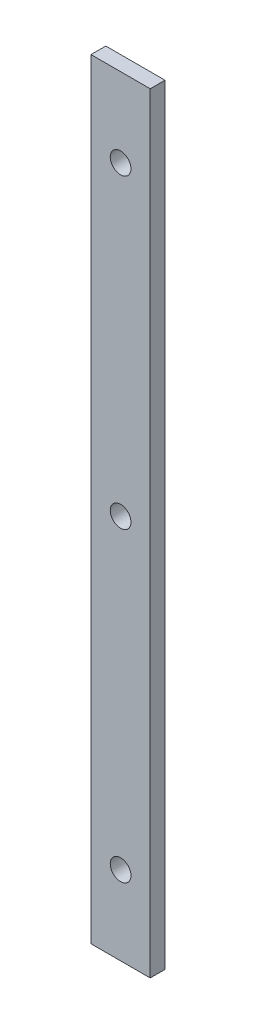
ISO-10303-21;
HEADER;
FILE_DESCRIPTION(('STEP AP214'),'2;1');
FILE_NAME('part.step','',(''),(''),'','','');
FILE_SCHEMA(('AUTOMOTIVE_DESIGN { 1 0 10303 214 1 1 1 1 }'));
ENDSEC;
DATA;
#1=APPLICATION_CONTEXT('core data for automotive mechanical design processes');
#2=APPLICATION_PROTOCOL_DEFINITION('international standard','automotive_design',2000,#1);
#3=PRODUCT_CONTEXT('',#1,'mechanical');
#4=PRODUCT('Part','Part','',(#3));
#5=PRODUCT_RELATED_PRODUCT_CATEGORY('part','',(#4));
#6=PRODUCT_DEFINITION_FORMATION('','',#4);
#7=PRODUCT_DEFINITION_CONTEXT('part definition',#1,'design');
#8=PRODUCT_DEFINITION('design','',#6,#7);
#9=PRODUCT_DEFINITION_SHAPE('','',#8);
#10=(LENGTH_UNIT() NAMED_UNIT(*) SI_UNIT(.MILLI.,.METRE.));
#11=(NAMED_UNIT(*) PLANE_ANGLE_UNIT() SI_UNIT($,.RADIAN.));
#12=(NAMED_UNIT(*) SI_UNIT($,.STERADIAN.) SOLID_ANGLE_UNIT());
#13=UNCERTAINTY_MEASURE_WITH_UNIT(LENGTH_MEASURE(1.E-05),#10,'distance_accuracy_value','');
#14=(GEOMETRIC_REPRESENTATION_CONTEXT(3) GLOBAL_UNCERTAINTY_ASSIGNED_CONTEXT((#13)) GLOBAL_UNIT_ASSIGNED_CONTEXT((#10,
#11,#12)) REPRESENTATION_CONTEXT('',''));
#15=CARTESIAN_POINT('',(0.,0.,0.));
#16=DIRECTION('',(0.,0.,1.));
#17=DIRECTION('',(1.,0.,0.));
#18=AXIS2_PLACEMENT_3D('',#15,#16,#17);
#19=CARTESIAN_POINT('',(82.55,78.,3.));
#20=DIRECTION('',(-1.,0.,0.));
#21=DIRECTION('',(0.,-1.,0.));
#22=AXIS2_PLACEMENT_3D('',#19,#20,#21);
#23=PLANE('',#22);
#24=DIRECTION('',(0.,1.,0.));
#25=VECTOR('',#24,1.);
#26=CARTESIAN_POINT('',(82.55,78.,0.));
#27=LINE('',#26,#25);
#28=CARTESIAN_POINT('',(82.55,-78.,0.));
#29=VERTEX_POINT('',#28);
#30=CARTESIAN_POINT('',(82.55,78.,0.));
#31=VERTEX_POINT('',#30);
#32=EDGE_CURVE('E109',#29,#31,#27,.T.);
#33=ORIENTED_EDGE('',*,*,#32,.T.);
#34=DIRECTION('',(0.,0.,-1.));
#35=VECTOR('',#34,1.);
#36=CARTESIAN_POINT('',(82.55,78.,3.));
#37=LINE('',#36,#35);
#38=CARTESIAN_POINT('',(82.55,78.,3.));
#39=VERTEX_POINT('',#38);
#40=EDGE_CURVE('E11',#39,#31,#37,.T.);
#41=ORIENTED_EDGE('',*,*,#40,.F.);
#42=DIRECTION('',(0.,1.,0.));
#43=VECTOR('',#42,1.);
#44=CARTESIAN_POINT('',(82.55,78.,3.));
#45=LINE('',#44,#43);
#46=CARTESIAN_POINT('',(82.55,-78.,3.));
#47=VERTEX_POINT('',#46);
#48=EDGE_CURVE('E92',#47,#39,#45,.T.);
#49=ORIENTED_EDGE('',*,*,#48,.F.);
#50=DIRECTION('',(0.,0.,-1.));
#51=VECTOR('',#50,1.);
#52=CARTESIAN_POINT('',(82.55,-78.,3.));
#53=LINE('',#52,#51);
#54=EDGE_CURVE('E105',#47,#29,#53,.T.);
#55=ORIENTED_EDGE('',*,*,#54,.T.);
#56=EDGE_LOOP('',(#33,#41,#49,#55));
#57=FACE_BOUND('',#56,.T.);
#58=ADVANCED_FACE('F38',(#57),#23,.F.);
#59=CARTESIAN_POINT('',(82.55,78.,3.));
#60=DIRECTION('',(0.,-1.,0.));
#61=DIRECTION('',(0.,0.,-1.));
#62=AXIS2_PLACEMENT_3D('',#59,#60,#61);
#63=PLANE('',#62);
#64=DIRECTION('',(-1.,0.,0.));
#65=VECTOR('',#64,1.);
#66=CARTESIAN_POINT('',(82.55,78.,0.));
#67=LINE('',#66,#65);
#68=CARTESIAN_POINT('',(70.55,78.,0.));
#69=VERTEX_POINT('',#68);
#70=EDGE_CURVE('E97',#31,#69,#67,.T.);
#71=ORIENTED_EDGE('',*,*,#70,.T.);
#72=DIRECTION('',(0.,0.,-1.));
#73=VECTOR('',#72,1.);
#74=CARTESIAN_POINT('',(70.55,78.,3.));
#75=LINE('',#74,#73);
#76=CARTESIAN_POINT('',(70.55,78.,3.));
#77=VERTEX_POINT('',#76);
#78=EDGE_CURVE('E46',#77,#69,#75,.T.);
#79=ORIENTED_EDGE('',*,*,#78,.F.);
#80=DIRECTION('',(-1.,0.,0.));
#81=VECTOR('',#80,1.);
#82=CARTESIAN_POINT('',(82.55,78.,3.));
#83=LINE('',#82,#81);
#84=EDGE_CURVE('E87',#39,#77,#83,.T.);
#85=ORIENTED_EDGE('',*,*,#84,.F.);
#86=ORIENTED_EDGE('',*,*,#40,.T.);
#87=EDGE_LOOP('',(#71,#79,#85,#86));
#88=FACE_BOUND('',#87,.T.);
#89=ADVANCED_FACE('F96',(#88),#63,.F.);
#90=CARTESIAN_POINT('',(70.55,78.,3.));
#91=DIRECTION('',(1.,0.,0.));
#92=DIRECTION('',(0.,1.,0.));
#93=AXIS2_PLACEMENT_3D('',#90,#91,#92);
#94=PLANE('',#93);
#95=DIRECTION('',(0.,-1.,0.));
#96=VECTOR('',#95,1.);
#97=CARTESIAN_POINT('',(70.55,78.,0.));
#98=LINE('',#97,#96);
#99=CARTESIAN_POINT('',(70.55,-78.,0.));
#100=VERTEX_POINT('',#99);
#101=EDGE_CURVE('E72',#69,#100,#98,.T.);
#102=ORIENTED_EDGE('',*,*,#101,.T.);
#103=DIRECTION('',(0.,0.,-1.));
#104=VECTOR('',#103,1.);
#105=CARTESIAN_POINT('',(70.55,-78.,3.));
#106=LINE('',#105,#104);
#107=CARTESIAN_POINT('',(70.55,-78.,3.));
#108=VERTEX_POINT('',#107);
#109=EDGE_CURVE('E99',#108,#100,#106,.T.);
#110=ORIENTED_EDGE('',*,*,#109,.F.);
#111=DIRECTION('',(0.,-1.,0.));
#112=VECTOR('',#111,1.);
#113=CARTESIAN_POINT('',(70.55,78.,3.));
#114=LINE('',#113,#112);
#115=EDGE_CURVE('E90',#77,#108,#114,.T.);
#116=ORIENTED_EDGE('',*,*,#115,.F.);
#117=ORIENTED_EDGE('',*,*,#78,.T.);
#118=EDGE_LOOP('',(#102,#110,#116,#117));
#119=FACE_BOUND('',#118,.T.);
#120=ADVANCED_FACE('F100',(#119),#94,.F.);
#121=CARTESIAN_POINT('',(82.55,-78.,3.));
#122=DIRECTION('',(0.,1.,0.));
#123=DIRECTION('',(0.,0.,1.));
#124=AXIS2_PLACEMENT_3D('',#121,#122,#123);
#125=PLANE('',#124);
#126=DIRECTION('',(1.,0.,0.));
#127=VECTOR('',#126,1.);
#128=CARTESIAN_POINT('',(82.55,-78.,0.));
#129=LINE('',#128,#127);
#130=EDGE_CURVE('E80',#100,#29,#129,.T.);
#131=ORIENTED_EDGE('',*,*,#130,.T.);
#132=ORIENTED_EDGE('',*,*,#54,.F.);
#133=DIRECTION('',(1.,0.,0.));
#134=VECTOR('',#133,1.);
#135=CARTESIAN_POINT('',(82.55,-78.,3.));
#136=LINE('',#135,#134);
#137=EDGE_CURVE('E54',#108,#47,#136,.T.);
#138=ORIENTED_EDGE('',*,*,#137,.F.);
#139=ORIENTED_EDGE('',*,*,#109,.T.);
#140=EDGE_LOOP('',(#131,#132,#138,#139));
#141=FACE_BOUND('',#140,.T.);
#142=ADVANCED_FACE('F120',(#141),#125,.F.);
#143=CARTESIAN_POINT('',(0.,0.,3.));
#144=DIRECTION('',(0.,0.,-1.));
#145=DIRECTION('',(-1.,0.,0.));
#146=AXIS2_PLACEMENT_3D('',#143,#144,#145);
#147=PLANE('',#146);
#148=CARTESIAN_POINT('',(76.55,62.,3.));
#149=DIRECTION('',(0.,0.,-1.));
#150=DIRECTION('',(-1.,0.,0.));
#151=AXIS2_PLACEMENT_3D('',#148,#149,#150);
#152=CIRCLE('',#151,2.1);
#153=CARTESIAN_POINT('',(74.45,62.,3.));
#154=VERTEX_POINT('',#153);
#155=EDGE_CURVE('E142',#154,#154,#152,.F.);
#156=ORIENTED_EDGE('',*,*,#155,.F.);
#157=EDGE_LOOP('',(#156));
#158=FACE_BOUND('',#157,.T.);
#159=CARTESIAN_POINT('',(76.55,0.,3.));
#160=DIRECTION('',(0.,0.,-1.));
#161=DIRECTION('',(-1.,0.,0.));
#162=AXIS2_PLACEMENT_3D('',#159,#160,#161);
#163=CIRCLE('',#162,2.1);
#164=CARTESIAN_POINT('',(74.45,0.,3.));
#165=VERTEX_POINT('',#164);
#166=EDGE_CURVE('E134',#165,#165,#163,.F.);
#167=ORIENTED_EDGE('',*,*,#166,.F.);
#168=EDGE_LOOP('',(#167));
#169=FACE_BOUND('',#168,.T.);
#170=CARTESIAN_POINT('',(76.55,-62.,3.));
#171=DIRECTION('',(0.,0.,-1.));
#172=DIRECTION('',(-1.,0.,0.));
#173=AXIS2_PLACEMENT_3D('',#170,#171,#172);
#174=CIRCLE('',#173,2.1);
#175=CARTESIAN_POINT('',(74.45,-62.,3.));
#176=VERTEX_POINT('',#175);
#177=EDGE_CURVE('E112',#176,#176,#174,.F.);
#178=ORIENTED_EDGE('',*,*,#177,.F.);
#179=EDGE_LOOP('',(#178));
#180=FACE_BOUND('',#179,.T.);
#181=ORIENTED_EDGE('',*,*,#48,.T.);
#182=ORIENTED_EDGE('',*,*,#84,.T.);
#183=ORIENTED_EDGE('',*,*,#115,.T.);
#184=ORIENTED_EDGE('',*,*,#137,.T.);
#185=EDGE_LOOP('',(#181,#182,#183,#184));
#186=FACE_BOUND('',#185,.T.);
#187=ADVANCED_FACE('F88',(#158,#169,#180,#186),#147,.F.);
#188=CARTESIAN_POINT('',(0.,0.,0.));
#189=DIRECTION('',(0.,0.,-1.));
#190=DIRECTION('',(-1.,0.,0.));
#191=AXIS2_PLACEMENT_3D('',#188,#189,#190);
#192=PLANE('',#191);
#193=CARTESIAN_POINT('',(76.55,62.,0.));
#194=DIRECTION('',(0.,0.,-1.));
#195=DIRECTION('',(-1.,0.,0.));
#196=AXIS2_PLACEMENT_3D('',#193,#194,#195);
#197=CIRCLE('',#196,2.1);
#198=CARTESIAN_POINT('',(74.45,62.,0.));
#199=VERTEX_POINT('',#198);
#200=EDGE_CURVE('E145',#199,#199,#197,.T.);
#201=ORIENTED_EDGE('',*,*,#200,.F.);
#202=EDGE_LOOP('',(#201));
#203=FACE_BOUND('',#202,.T.);
#204=CARTESIAN_POINT('',(76.55,0.,0.));
#205=DIRECTION('',(0.,0.,-1.));
#206=DIRECTION('',(-1.,0.,0.));
#207=AXIS2_PLACEMENT_3D('',#204,#205,#206);
#208=CIRCLE('',#207,2.1);
#209=CARTESIAN_POINT('',(74.45,0.,0.));
#210=VERTEX_POINT('',#209);
#211=EDGE_CURVE('E138',#210,#210,#208,.T.);
#212=ORIENTED_EDGE('',*,*,#211,.F.);
#213=EDGE_LOOP('',(#212));
#214=FACE_BOUND('',#213,.T.);
#215=CARTESIAN_POINT('',(76.55,-62.,0.));
#216=DIRECTION('',(0.,0.,-1.));
#217=DIRECTION('',(-1.,0.,0.));
#218=AXIS2_PLACEMENT_3D('',#215,#216,#217);
#219=CIRCLE('',#218,2.1);
#220=CARTESIAN_POINT('',(74.45,-62.,0.));
#221=VERTEX_POINT('',#220);
#222=EDGE_CURVE('E130',#221,#221,#219,.T.);
#223=ORIENTED_EDGE('',*,*,#222,.F.);
#224=EDGE_LOOP('',(#223));
#225=FACE_BOUND('',#224,.T.);
#226=ORIENTED_EDGE('',*,*,#32,.F.);
#227=ORIENTED_EDGE('',*,*,#130,.F.);
#228=ORIENTED_EDGE('',*,*,#101,.F.);
#229=ORIENTED_EDGE('',*,*,#70,.F.);
#230=EDGE_LOOP('',(#226,#227,#228,#229));
#231=FACE_BOUND('',#230,.T.);
#232=ADVANCED_FACE('F123',(#203,#214,#225,#231),#192,.T.);
#233=CARTESIAN_POINT('',(76.55,-62.,3.001));
#234=DIRECTION('',(0.,0.,-1.));
#235=DIRECTION('',(-1.,0.,0.));
#236=AXIS2_PLACEMENT_3D('',#233,#234,#235);
#237=CYLINDRICAL_SURFACE('',#236,2.1);
#238=CARTESIAN_POINT('',(74.45,-62.,0.));
#239=CARTESIAN_POINT('',(74.45,-62.,0.0312500000000005));
#240=CARTESIAN_POINT('',(74.45,-62.,0.0625000000000005));
#241=CARTESIAN_POINT('',(74.45,-62.,0.125000000000001));
#242=CARTESIAN_POINT('',(74.45,-62.,0.156250000000001));
#243=CARTESIAN_POINT('',(74.45,-62.,0.218750000000001));
#244=CARTESIAN_POINT('',(74.45,-62.,0.250000000000001));
#245=CARTESIAN_POINT('',(74.45,-62.,0.312500000000001));
#246=CARTESIAN_POINT('',(74.45,-62.,0.34375));
#247=CARTESIAN_POINT('',(74.45,-62.,0.40625));
#248=CARTESIAN_POINT('',(74.45,-62.,0.4375));
#249=CARTESIAN_POINT('',(74.45,-62.,0.5));
#250=CARTESIAN_POINT('',(74.45,-62.,0.53125));
#251=CARTESIAN_POINT('',(74.45,-62.,0.593750000000001));
#252=CARTESIAN_POINT('',(74.45,-62.,0.625000000000001));
#253=CARTESIAN_POINT('',(74.45,-62.,0.687500000000001));
#254=CARTESIAN_POINT('',(74.45,-62.,0.71875));
#255=CARTESIAN_POINT('',(74.45,-62.,0.78125));
#256=CARTESIAN_POINT('',(74.45,-62.,0.8125));
#257=CARTESIAN_POINT('',(74.45,-62.,0.875));
#258=CARTESIAN_POINT('',(74.45,-62.,0.90625));
#259=CARTESIAN_POINT('',(74.45,-62.,0.96875));
#260=CARTESIAN_POINT('',(74.45,-62.,1.));
#261=CARTESIAN_POINT('',(74.45,-62.,1.0625));
#262=CARTESIAN_POINT('',(74.45,-62.,1.09375));
#263=CARTESIAN_POINT('',(74.45,-62.,1.15625));
#264=CARTESIAN_POINT('',(74.45,-62.,1.1875));
#265=CARTESIAN_POINT('',(74.45,-62.,1.25));
#266=CARTESIAN_POINT('',(74.45,-62.,1.28125));
#267=CARTESIAN_POINT('',(74.45,-62.,1.34375));
#268=CARTESIAN_POINT('',(74.45,-62.,1.375));
#269=CARTESIAN_POINT('',(74.45,-62.,1.4375));
#270=CARTESIAN_POINT('',(74.45,-62.,1.46875));
#271=CARTESIAN_POINT('',(74.45,-62.,1.53125));
#272=CARTESIAN_POINT('',(74.45,-62.,1.5625));
#273=CARTESIAN_POINT('',(74.45,-62.,1.625));
#274=CARTESIAN_POINT('',(74.45,-62.,1.65625));
#275=CARTESIAN_POINT('',(74.45,-62.,1.71875));
#276=CARTESIAN_POINT('',(74.45,-62.,1.75));
#277=CARTESIAN_POINT('',(74.45,-62.,1.8125));
#278=CARTESIAN_POINT('',(74.45,-62.,1.84375));
#279=CARTESIAN_POINT('',(74.45,-62.,1.90625));
#280=CARTESIAN_POINT('',(74.45,-62.,1.9375));
#281=CARTESIAN_POINT('',(74.45,-62.,2.));
#282=CARTESIAN_POINT('',(74.45,-62.,2.03125));
#283=CARTESIAN_POINT('',(74.45,-62.,2.09375));
#284=CARTESIAN_POINT('',(74.45,-62.,2.125));
#285=CARTESIAN_POINT('',(74.45,-62.,2.1875));
#286=CARTESIAN_POINT('',(74.45,-62.,2.21875));
#287=CARTESIAN_POINT('',(74.45,-62.,2.28125));
#288=CARTESIAN_POINT('',(74.45,-62.,2.3125));
#289=CARTESIAN_POINT('',(74.45,-62.,2.375));
#290=CARTESIAN_POINT('',(74.45,-62.,2.40625));
#291=CARTESIAN_POINT('',(74.45,-62.,2.46875));
#292=CARTESIAN_POINT('',(74.45,-62.,2.5));
#293=CARTESIAN_POINT('',(74.45,-62.,2.5625));
#294=CARTESIAN_POINT('',(74.45,-62.,2.59375));
#295=CARTESIAN_POINT('',(74.45,-62.,2.65625));
#296=CARTESIAN_POINT('',(74.45,-62.,2.6875));
#297=CARTESIAN_POINT('',(74.45,-62.,2.75));
#298=CARTESIAN_POINT('',(74.45,-62.,2.78125));
#299=CARTESIAN_POINT('',(74.45,-62.,2.84375));
#300=CARTESIAN_POINT('',(74.45,-62.,2.875));
#301=CARTESIAN_POINT('',(74.45,-62.,2.9375));
#302=CARTESIAN_POINT('',(74.45,-62.,2.96875));
#303=CARTESIAN_POINT('',(74.45,-62.,3.));
#304=B_SPLINE_CURVE_WITH_KNOTS('',3,(#238,#239,#240,#241,#242,#243,#244,#245,#246,#247,#248,
#249,#250,#251,#252,#253,#254,#255,#256,#257,#258,#259,#260,#261,#262,#263,#264,#265,#266,#267,
#268,#269,#270,#271,#272,#273,#274,#275,#276,#277,#278,#279,#280,#281,#282,#283,#284,#285,#286,
#287,#288,#289,#290,#291,#292,#293,#294,#295,#296,#297,#298,#299,#300,#301,#302,#303),
.UNSPECIFIED.,.F.,.F.,(4,2,2,2,2,2,2,2,2,2,2,2,2,2,2,2,2,2,2,2,2,2,2,2,2,2,2,2,2,2,2,2,4),(0.,
0.0937500000000001,0.1875,0.28125,0.375,0.46875,0.5625,0.65625,0.75,0.84375,0.9375,1.03125,
1.125,1.21875,1.3125,1.40625,1.5,1.59375,1.6875,1.78125,1.875,1.96875,2.0625,2.15625,2.25,
2.34375,2.4375,2.53125,2.625,2.71875,2.8125,2.90625,3.),.UNSPECIFIED.);
#305=EDGE_CURVE('BSEAM154',#221,#176,#304,.T.);
#306=ORIENTED_EDGE('',*,*,#222,.T.);
#307=ORIENTED_EDGE('',*,*,#177,.T.);
#308=ORIENTED_EDGE('',*,*,#305,.T.);
#309=ORIENTED_EDGE('',*,*,#305,.F.);
#310=EDGE_LOOP('',(#306,#308,#307,#309));
#311=FACE_BOUND('',#310,.T.);
#312=ADVANCED_FACE('F154',(#311),#237,.F.);
#313=CARTESIAN_POINT('',(76.55,0.,3.001));
#314=DIRECTION('',(0.,0.,-1.));
#315=DIRECTION('',(-1.,0.,0.));
#316=AXIS2_PLACEMENT_3D('',#313,#314,#315);
#317=CYLINDRICAL_SURFACE('',#316,2.1);
#318=CARTESIAN_POINT('',(74.45,0.,0.));
#319=CARTESIAN_POINT('',(74.45,0.,0.0312500000000005));
#320=CARTESIAN_POINT('',(74.45,0.,0.0625000000000005));
#321=CARTESIAN_POINT('',(74.45,0.,0.125000000000001));
#322=CARTESIAN_POINT('',(74.45,0.,0.156250000000001));
#323=CARTESIAN_POINT('',(74.45,0.,0.218750000000001));
#324=CARTESIAN_POINT('',(74.45,0.,0.250000000000001));
#325=CARTESIAN_POINT('',(74.45,0.,0.312500000000001));
#326=CARTESIAN_POINT('',(74.45,0.,0.34375));
#327=CARTESIAN_POINT('',(74.45,0.,0.40625));
#328=CARTESIAN_POINT('',(74.45,0.,0.4375));
#329=CARTESIAN_POINT('',(74.45,0.,0.5));
#330=CARTESIAN_POINT('',(74.45,0.,0.53125));
#331=CARTESIAN_POINT('',(74.45,0.,0.593750000000001));
#332=CARTESIAN_POINT('',(74.45,0.,0.625000000000001));
#333=CARTESIAN_POINT('',(74.45,0.,0.687500000000001));
#334=CARTESIAN_POINT('',(74.45,0.,0.71875));
#335=CARTESIAN_POINT('',(74.45,0.,0.78125));
#336=CARTESIAN_POINT('',(74.45,0.,0.8125));
#337=CARTESIAN_POINT('',(74.45,0.,0.875));
#338=CARTESIAN_POINT('',(74.45,0.,0.90625));
#339=CARTESIAN_POINT('',(74.45,0.,0.96875));
#340=CARTESIAN_POINT('',(74.45,0.,1.));
#341=CARTESIAN_POINT('',(74.45,0.,1.0625));
#342=CARTESIAN_POINT('',(74.45,0.,1.09375));
#343=CARTESIAN_POINT('',(74.45,0.,1.15625));
#344=CARTESIAN_POINT('',(74.45,0.,1.1875));
#345=CARTESIAN_POINT('',(74.45,0.,1.25));
#346=CARTESIAN_POINT('',(74.45,0.,1.28125));
#347=CARTESIAN_POINT('',(74.45,0.,1.34375));
#348=CARTESIAN_POINT('',(74.45,0.,1.375));
#349=CARTESIAN_POINT('',(74.45,0.,1.4375));
#350=CARTESIAN_POINT('',(74.45,0.,1.46875));
#351=CARTESIAN_POINT('',(74.45,0.,1.53125));
#352=CARTESIAN_POINT('',(74.45,0.,1.5625));
#353=CARTESIAN_POINT('',(74.45,0.,1.625));
#354=CARTESIAN_POINT('',(74.45,0.,1.65625));
#355=CARTESIAN_POINT('',(74.45,0.,1.71875));
#356=CARTESIAN_POINT('',(74.45,0.,1.75));
#357=CARTESIAN_POINT('',(74.45,0.,1.8125));
#358=CARTESIAN_POINT('',(74.45,0.,1.84375));
#359=CARTESIAN_POINT('',(74.45,0.,1.90625));
#360=CARTESIAN_POINT('',(74.45,0.,1.9375));
#361=CARTESIAN_POINT('',(74.45,0.,2.));
#362=CARTESIAN_POINT('',(74.45,0.,2.03125));
#363=CARTESIAN_POINT('',(74.45,0.,2.09375));
#364=CARTESIAN_POINT('',(74.45,0.,2.125));
#365=CARTESIAN_POINT('',(74.45,0.,2.1875));
#366=CARTESIAN_POINT('',(74.45,0.,2.21875));
#367=CARTESIAN_POINT('',(74.45,0.,2.28125));
#368=CARTESIAN_POINT('',(74.45,0.,2.3125));
#369=CARTESIAN_POINT('',(74.45,0.,2.375));
#370=CARTESIAN_POINT('',(74.45,0.,2.40625));
#371=CARTESIAN_POINT('',(74.45,0.,2.46875));
#372=CARTESIAN_POINT('',(74.45,0.,2.5));
#373=CARTESIAN_POINT('',(74.45,0.,2.5625));
#374=CARTESIAN_POINT('',(74.45,0.,2.59375));
#375=CARTESIAN_POINT('',(74.45,0.,2.65625));
#376=CARTESIAN_POINT('',(74.45,0.,2.6875));
#377=CARTESIAN_POINT('',(74.45,0.,2.75));
#378=CARTESIAN_POINT('',(74.45,0.,2.78125));
#379=CARTESIAN_POINT('',(74.45,0.,2.84375));
#380=CARTESIAN_POINT('',(74.45,0.,2.875));
#381=CARTESIAN_POINT('',(74.45,0.,2.9375));
#382=CARTESIAN_POINT('',(74.45,0.,2.96875));
#383=CARTESIAN_POINT('',(74.45,0.,3.));
#384=B_SPLINE_CURVE_WITH_KNOTS('',3,(#318,#319,#320,#321,#322,#323,#324,#325,#326,#327,#328,
#329,#330,#331,#332,#333,#334,#335,#336,#337,#338,#339,#340,#341,#342,#343,#344,#345,#346,#347,
#348,#349,#350,#351,#352,#353,#354,#355,#356,#357,#358,#359,#360,#361,#362,#363,#364,#365,#366,
#367,#368,#369,#370,#371,#372,#373,#374,#375,#376,#377,#378,#379,#380,#381,#382,#383),
.UNSPECIFIED.,.F.,.F.,(4,2,2,2,2,2,2,2,2,2,2,2,2,2,2,2,2,2,2,2,2,2,2,2,2,2,2,2,2,2,2,2,4),(0.,
0.0937500000000001,0.1875,0.28125,0.375,0.46875,0.5625,0.65625,0.75,0.84375,0.9375,1.03125,
1.125,1.21875,1.3125,1.40625,1.5,1.59375,1.6875,1.78125,1.875,1.96875,2.0625,2.15625,2.25,
2.34375,2.4375,2.53125,2.625,2.71875,2.8125,2.90625,3.),.UNSPECIFIED.);
#385=EDGE_CURVE('BSEAM162',#210,#165,#384,.T.);
#386=ORIENTED_EDGE('',*,*,#211,.T.);
#387=ORIENTED_EDGE('',*,*,#166,.T.);
#388=ORIENTED_EDGE('',*,*,#385,.T.);
#389=ORIENTED_EDGE('',*,*,#385,.F.);
#390=EDGE_LOOP('',(#386,#388,#387,#389));
#391=FACE_BOUND('',#390,.T.);
#392=ADVANCED_FACE('F162',(#391),#317,.F.);
#393=CARTESIAN_POINT('',(76.55,62.,3.001));
#394=DIRECTION('',(0.,0.,-1.));
#395=DIRECTION('',(-1.,0.,0.));
#396=AXIS2_PLACEMENT_3D('',#393,#394,#395);
#397=CYLINDRICAL_SURFACE('',#396,2.1);
#398=CARTESIAN_POINT('',(74.45,62.,0.));
#399=CARTESIAN_POINT('',(74.45,62.,0.0312500000000005));
#400=CARTESIAN_POINT('',(74.45,62.,0.0625000000000005));
#401=CARTESIAN_POINT('',(74.45,62.,0.125000000000001));
#402=CARTESIAN_POINT('',(74.45,62.,0.156250000000001));
#403=CARTESIAN_POINT('',(74.45,62.,0.218750000000001));
#404=CARTESIAN_POINT('',(74.45,62.,0.250000000000001));
#405=CARTESIAN_POINT('',(74.45,62.,0.312500000000001));
#406=CARTESIAN_POINT('',(74.45,62.,0.34375));
#407=CARTESIAN_POINT('',(74.45,62.,0.40625));
#408=CARTESIAN_POINT('',(74.45,62.,0.4375));
#409=CARTESIAN_POINT('',(74.45,62.,0.5));
#410=CARTESIAN_POINT('',(74.45,62.,0.53125));
#411=CARTESIAN_POINT('',(74.45,62.,0.593750000000001));
#412=CARTESIAN_POINT('',(74.45,62.,0.625000000000001));
#413=CARTESIAN_POINT('',(74.45,62.,0.687500000000001));
#414=CARTESIAN_POINT('',(74.45,62.,0.71875));
#415=CARTESIAN_POINT('',(74.45,62.,0.78125));
#416=CARTESIAN_POINT('',(74.45,62.,0.8125));
#417=CARTESIAN_POINT('',(74.45,62.,0.875));
#418=CARTESIAN_POINT('',(74.45,62.,0.90625));
#419=CARTESIAN_POINT('',(74.45,62.,0.96875));
#420=CARTESIAN_POINT('',(74.45,62.,1.));
#421=CARTESIAN_POINT('',(74.45,62.,1.0625));
#422=CARTESIAN_POINT('',(74.45,62.,1.09375));
#423=CARTESIAN_POINT('',(74.45,62.,1.15625));
#424=CARTESIAN_POINT('',(74.45,62.,1.1875));
#425=CARTESIAN_POINT('',(74.45,62.,1.25));
#426=CARTESIAN_POINT('',(74.45,62.,1.28125));
#427=CARTESIAN_POINT('',(74.45,62.,1.34375));
#428=CARTESIAN_POINT('',(74.45,62.,1.375));
#429=CARTESIAN_POINT('',(74.45,62.,1.4375));
#430=CARTESIAN_POINT('',(74.45,62.,1.46875));
#431=CARTESIAN_POINT('',(74.45,62.,1.53125));
#432=CARTESIAN_POINT('',(74.45,62.,1.5625));
#433=CARTESIAN_POINT('',(74.45,62.,1.625));
#434=CARTESIAN_POINT('',(74.45,62.,1.65625));
#435=CARTESIAN_POINT('',(74.45,62.,1.71875));
#436=CARTESIAN_POINT('',(74.45,62.,1.75));
#437=CARTESIAN_POINT('',(74.45,62.,1.8125));
#438=CARTESIAN_POINT('',(74.45,62.,1.84375));
#439=CARTESIAN_POINT('',(74.45,62.,1.90625));
#440=CARTESIAN_POINT('',(74.45,62.,1.9375));
#441=CARTESIAN_POINT('',(74.45,62.,2.));
#442=CARTESIAN_POINT('',(74.45,62.,2.03125));
#443=CARTESIAN_POINT('',(74.45,62.,2.09375));
#444=CARTESIAN_POINT('',(74.45,62.,2.125));
#445=CARTESIAN_POINT('',(74.45,62.,2.1875));
#446=CARTESIAN_POINT('',(74.45,62.,2.21875));
#447=CARTESIAN_POINT('',(74.45,62.,2.28125));
#448=CARTESIAN_POINT('',(74.45,62.,2.3125));
#449=CARTESIAN_POINT('',(74.45,62.,2.375));
#450=CARTESIAN_POINT('',(74.45,62.,2.40625));
#451=CARTESIAN_POINT('',(74.45,62.,2.46875));
#452=CARTESIAN_POINT('',(74.45,62.,2.5));
#453=CARTESIAN_POINT('',(74.45,62.,2.5625));
#454=CARTESIAN_POINT('',(74.45,62.,2.59375));
#455=CARTESIAN_POINT('',(74.45,62.,2.65625));
#456=CARTESIAN_POINT('',(74.45,62.,2.6875));
#457=CARTESIAN_POINT('',(74.45,62.,2.75));
#458=CARTESIAN_POINT('',(74.45,62.,2.78125));
#459=CARTESIAN_POINT('',(74.45,62.,2.84375));
#460=CARTESIAN_POINT('',(74.45,62.,2.875));
#461=CARTESIAN_POINT('',(74.45,62.,2.9375));
#462=CARTESIAN_POINT('',(74.45,62.,2.96875));
#463=CARTESIAN_POINT('',(74.45,62.,3.));
#464=B_SPLINE_CURVE_WITH_KNOTS('',3,(#398,#399,#400,#401,#402,#403,#404,#405,#406,#407,#408,
#409,#410,#411,#412,#413,#414,#415,#416,#417,#418,#419,#420,#421,#422,#423,#424,#425,#426,#427,
#428,#429,#430,#431,#432,#433,#434,#435,#436,#437,#438,#439,#440,#441,#442,#443,#444,#445,#446,
#447,#448,#449,#450,#451,#452,#453,#454,#455,#456,#457,#458,#459,#460,#461,#462,#463),
.UNSPECIFIED.,.F.,.F.,(4,2,2,2,2,2,2,2,2,2,2,2,2,2,2,2,2,2,2,2,2,2,2,2,2,2,2,2,2,2,2,2,4),(0.,
0.0937500000000001,0.1875,0.28125,0.375,0.46875,0.5625,0.65625,0.75,0.84375,0.9375,1.03125,
1.125,1.21875,1.3125,1.40625,1.5,1.59375,1.6875,1.78125,1.875,1.96875,2.0625,2.15625,2.25,
2.34375,2.4375,2.53125,2.625,2.71875,2.8125,2.90625,3.),.UNSPECIFIED.);
#465=EDGE_CURVE('BSEAM149',#199,#154,#464,.T.);
#466=ORIENTED_EDGE('',*,*,#200,.T.);
#467=ORIENTED_EDGE('',*,*,#155,.T.);
#468=ORIENTED_EDGE('',*,*,#465,.T.);
#469=ORIENTED_EDGE('',*,*,#465,.F.);
#470=EDGE_LOOP('',(#466,#468,#467,#469));
#471=FACE_BOUND('',#470,.T.);
#472=ADVANCED_FACE('F149',(#471),#397,.F.);
#473=CLOSED_SHELL('',(#58,#89,#120,#142,#187,#232,#312,#392,#472));
#474=MANIFOLD_SOLID_BREP('B2',#473);
#475=ADVANCED_BREP_SHAPE_REPRESENTATION('',(#18,#474),#14);
#476=SHAPE_DEFINITION_REPRESENTATION(#9,#475);
ENDSEC;
END-ISO-10303-21;
